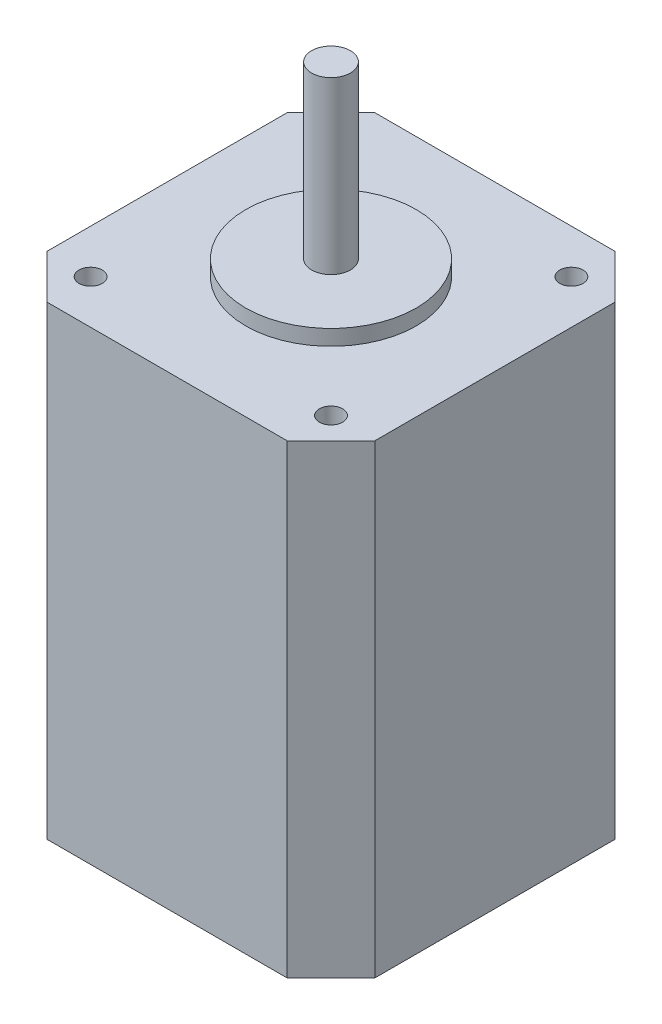
ISO-10303-21;
HEADER;
FILE_DESCRIPTION(('STEP AP214'),'2;1');
FILE_NAME('part.step','',(''),(''),'','','');
FILE_SCHEMA(('AUTOMOTIVE_DESIGN { 1 0 10303 214 1 1 1 1 }'));
ENDSEC;
DATA;
#1=APPLICATION_CONTEXT('core data for automotive mechanical design processes');
#2=APPLICATION_PROTOCOL_DEFINITION('international standard','automotive_design',2000,#1);
#3=PRODUCT_CONTEXT('',#1,'mechanical');
#4=PRODUCT('Part','Part','',(#3));
#5=PRODUCT_RELATED_PRODUCT_CATEGORY('part','',(#4));
#6=PRODUCT_DEFINITION_FORMATION('','',#4);
#7=PRODUCT_DEFINITION_CONTEXT('part definition',#1,'design');
#8=PRODUCT_DEFINITION('design','',#6,#7);
#9=PRODUCT_DEFINITION_SHAPE('','',#8);
#10=(LENGTH_UNIT() NAMED_UNIT(*) SI_UNIT(.MILLI.,.METRE.));
#11=(NAMED_UNIT(*) PLANE_ANGLE_UNIT() SI_UNIT($,.RADIAN.));
#12=(NAMED_UNIT(*) SI_UNIT($,.STERADIAN.) SOLID_ANGLE_UNIT());
#13=UNCERTAINTY_MEASURE_WITH_UNIT(LENGTH_MEASURE(1.E-05),#10,'distance_accuracy_value','');
#14=(GEOMETRIC_REPRESENTATION_CONTEXT(3) GLOBAL_UNCERTAINTY_ASSIGNED_CONTEXT((#13)) GLOBAL_UNIT_ASSIGNED_CONTEXT((#10,
#11,#12)) REPRESENTATION_CONTEXT('',''));
#15=CARTESIAN_POINT('',(0.,0.,0.));
#16=DIRECTION('',(0.,0.,1.));
#17=DIRECTION('',(1.,0.,0.));
#18=AXIS2_PLACEMENT_3D('',#15,#16,#17);
#19=CARTESIAN_POINT('',(0.,60.,0.));
#20=DIRECTION('',(0.,-1.,0.));
#21=DIRECTION('',(0.,0.,-1.));
#22=AXIS2_PLACEMENT_3D('',#19,#20,#21);
#23=PLANE('',#22);
#24=CARTESIAN_POINT('',(0.,60.,0.));
#25=DIRECTION('',(0.,-1.,0.));
#26=DIRECTION('',(0.,0.,-1.));
#27=AXIS2_PLACEMENT_3D('',#24,#25,#26);
#28=CIRCLE('',#27,11.);
#29=CARTESIAN_POINT('',(0.,60.,-11.));
#30=VERTEX_POINT('',#29);
#31=EDGE_CURVE('E38',#30,#30,#28,.F.);
#32=ORIENTED_EDGE('',*,*,#31,.F.);
#33=EDGE_LOOP('',(#32));
#34=FACE_BOUND('',#33,.T.);
#35=DIRECTION('',(0.707106781186548,0.,-0.707106781186547));
#36=VECTOR('',#35,1.);
#37=CARTESIAN_POINT('',(15.5,60.,21.15));
#38=LINE('',#37,#36);
#39=CARTESIAN_POINT('',(15.5,60.,21.15));
#40=VERTEX_POINT('',#39);
#41=CARTESIAN_POINT('',(21.15,60.,15.5));
#42=VERTEX_POINT('',#41);
#43=EDGE_CURVE('E148',#40,#42,#38,.T.);
#44=ORIENTED_EDGE('',*,*,#43,.T.);
#45=DIRECTION('',(0.,0.,-1.));
#46=VECTOR('',#45,1.);
#47=CARTESIAN_POINT('',(21.15,60.,-15.5));
#48=LINE('',#47,#46);
#49=CARTESIAN_POINT('',(21.15,60.,-15.5));
#50=VERTEX_POINT('',#49);
#51=EDGE_CURVE('E96',#42,#50,#48,.T.);
#52=ORIENTED_EDGE('',*,*,#51,.T.);
#53=DIRECTION('',(-0.707106781186547,0.,-0.707106781186548));
#54=VECTOR('',#53,1.);
#55=CARTESIAN_POINT('',(15.5,60.,-21.15));
#56=LINE('',#55,#54);
#57=CARTESIAN_POINT('',(15.5,60.,-21.15));
#58=VERTEX_POINT('',#57);
#59=EDGE_CURVE('E208',#50,#58,#56,.T.);
#60=ORIENTED_EDGE('',*,*,#59,.T.);
#61=DIRECTION('',(-1.,0.,0.));
#62=VECTOR('',#61,1.);
#63=CARTESIAN_POINT('',(-15.5,60.,-21.15));
#64=LINE('',#63,#62);
#65=CARTESIAN_POINT('',(-15.5,60.,-21.15));
#66=VERTEX_POINT('',#65);
#67=EDGE_CURVE('E214',#58,#66,#64,.T.);
#68=ORIENTED_EDGE('',*,*,#67,.T.);
#69=DIRECTION('',(-0.707106781186547,0.,0.707106781186547));
#70=VECTOR('',#69,1.);
#71=CARTESIAN_POINT('',(-21.15,60.,-15.5));
#72=LINE('',#71,#70);
#73=CARTESIAN_POINT('',(-21.15,60.,-15.5));
#74=VERTEX_POINT('',#73);
#75=EDGE_CURVE('E115',#66,#74,#72,.T.);
#76=ORIENTED_EDGE('',*,*,#75,.T.);
#77=DIRECTION('',(0.,0.,1.));
#78=VECTOR('',#77,1.);
#79=CARTESIAN_POINT('',(-21.15,60.,-15.5));
#80=LINE('',#79,#78);
#81=CARTESIAN_POINT('',(-21.15,60.,15.5));
#82=VERTEX_POINT('',#81);
#83=EDGE_CURVE('E109',#74,#82,#80,.T.);
#84=ORIENTED_EDGE('',*,*,#83,.T.);
#85=DIRECTION('',(0.707106781186548,0.,0.707106781186547));
#86=VECTOR('',#85,1.);
#87=CARTESIAN_POINT('',(-15.5,60.,21.15));
#88=LINE('',#87,#86);
#89=CARTESIAN_POINT('',(-15.5,60.,21.15));
#90=VERTEX_POINT('',#89);
#91=EDGE_CURVE('E113',#82,#90,#88,.T.);
#92=ORIENTED_EDGE('',*,*,#91,.T.);
#93=DIRECTION('',(1.,0.,0.));
#94=VECTOR('',#93,1.);
#95=CARTESIAN_POINT('',(-15.5,60.,21.15));
#96=LINE('',#95,#94);
#97=EDGE_CURVE('E52',#90,#40,#96,.T.);
#98=ORIENTED_EDGE('',*,*,#97,.T.);
#99=EDGE_LOOP('',(#44,#52,#60,#68,#76,#84,#92,#98));
#100=FACE_BOUND('',#99,.T.);
#101=CARTESIAN_POINT('',(-15.5,60.,-15.5));
#102=DIRECTION('',(0.,1.,0.));
#103=DIRECTION('',(0.,0.,1.));
#104=AXIS2_PLACEMENT_3D('',#101,#102,#103);
#105=CIRCLE('',#104,1.5);
#106=CARTESIAN_POINT('',(-15.5,60.,-17.));
#107=VERTEX_POINT('',#106);
#108=EDGE_CURVE('E137',#107,#107,#105,.T.);
#109=ORIENTED_EDGE('',*,*,#108,.F.);
#110=EDGE_LOOP('',(#109));
#111=FACE_BOUND('',#110,.T.);
#112=CARTESIAN_POINT('',(15.5,60.,-15.5));
#113=DIRECTION('',(0.,1.,0.));
#114=DIRECTION('',(0.,0.,1.));
#115=AXIS2_PLACEMENT_3D('',#112,#113,#114);
#116=CIRCLE('',#115,1.5);
#117=CARTESIAN_POINT('',(15.5,60.,-17.));
#118=VERTEX_POINT('',#117);
#119=EDGE_CURVE('E223',#118,#118,#116,.T.);
#120=ORIENTED_EDGE('',*,*,#119,.F.);
#121=EDGE_LOOP('',(#120));
#122=FACE_BOUND('',#121,.T.);
#123=CARTESIAN_POINT('',(15.5,60.,15.5));
#124=DIRECTION('',(0.,1.,0.));
#125=DIRECTION('',(0.,0.,-1.));
#126=AXIS2_PLACEMENT_3D('',#123,#124,#125);
#127=CIRCLE('',#126,1.5);
#128=CARTESIAN_POINT('',(15.5,60.,14.));
#129=VERTEX_POINT('',#128);
#130=EDGE_CURVE('E229',#129,#129,#127,.T.);
#131=ORIENTED_EDGE('',*,*,#130,.F.);
#132=EDGE_LOOP('',(#131));
#133=FACE_BOUND('',#132,.T.);
#134=CARTESIAN_POINT('',(-15.5,60.,15.5));
#135=DIRECTION('',(0.,1.,0.));
#136=DIRECTION('',(0.,0.,-1.));
#137=AXIS2_PLACEMENT_3D('',#134,#135,#136);
#138=CIRCLE('',#137,1.5);
#139=CARTESIAN_POINT('',(-15.5,60.,14.));
#140=VERTEX_POINT('',#139);
#141=EDGE_CURVE('E235',#140,#140,#138,.T.);
#142=ORIENTED_EDGE('',*,*,#141,.F.);
#143=EDGE_LOOP('',(#142));
#144=FACE_BOUND('',#143,.T.);
#145=ADVANCED_FACE('F34',(#34,#100,#111,#122,#133,#144),#23,.F.);
#146=CARTESIAN_POINT('',(0.,0.,0.));
#147=DIRECTION('',(0.,-1.,0.));
#148=DIRECTION('',(0.,0.,-1.));
#149=AXIS2_PLACEMENT_3D('',#146,#147,#148);
#150=PLANE('',#149);
#151=CARTESIAN_POINT('',(15.5,0.,15.5));
#152=DIRECTION('',(0.,1.,0.));
#153=DIRECTION('',(0.,0.,-1.));
#154=AXIS2_PLACEMENT_3D('',#151,#152,#153);
#155=CIRCLE('',#154,1.5);
#156=CARTESIAN_POINT('',(15.5,0.,14.));
#157=VERTEX_POINT('',#156);
#158=EDGE_CURVE('E232',#157,#157,#155,.T.);
#159=ORIENTED_EDGE('',*,*,#158,.T.);
#160=EDGE_LOOP('',(#159));
#161=FACE_BOUND('',#160,.T.);
#162=CARTESIAN_POINT('',(-15.5,0.,-15.5));
#163=DIRECTION('',(0.,1.,0.));
#164=DIRECTION('',(0.,0.,1.));
#165=AXIS2_PLACEMENT_3D('',#162,#163,#164);
#166=CIRCLE('',#165,1.5);
#167=CARTESIAN_POINT('',(-15.5,0.,-17.));
#168=VERTEX_POINT('',#167);
#169=EDGE_CURVE('E220',#168,#168,#166,.T.);
#170=ORIENTED_EDGE('',*,*,#169,.T.);
#171=EDGE_LOOP('',(#170));
#172=FACE_BOUND('',#171,.T.);
#173=DIRECTION('',(0.707106781186548,0.,-0.707106781186547));
#174=VECTOR('',#173,1.);
#175=CARTESIAN_POINT('',(15.5,0.,21.15));
#176=LINE('',#175,#174);
#177=CARTESIAN_POINT('',(15.5,0.,21.15));
#178=VERTEX_POINT('',#177);
#179=CARTESIAN_POINT('',(21.15,0.,15.5));
#180=VERTEX_POINT('',#179);
#181=EDGE_CURVE('E133',#178,#180,#176,.T.);
#182=ORIENTED_EDGE('',*,*,#181,.F.);
#183=DIRECTION('',(1.,0.,0.));
#184=VECTOR('',#183,1.);
#185=CARTESIAN_POINT('',(-15.5,0.,21.15));
#186=LINE('',#185,#184);
#187=CARTESIAN_POINT('',(-15.5,0.,21.15));
#188=VERTEX_POINT('',#187);
#189=EDGE_CURVE('E87',#188,#178,#186,.T.);
#190=ORIENTED_EDGE('',*,*,#189,.F.);
#191=DIRECTION('',(0.707106781186548,0.,0.707106781186547));
#192=VECTOR('',#191,1.);
#193=CARTESIAN_POINT('',(-15.5,0.,21.15));
#194=LINE('',#193,#192);
#195=CARTESIAN_POINT('',(-21.15,0.,15.5));
#196=VERTEX_POINT('',#195);
#197=EDGE_CURVE('E81',#196,#188,#194,.T.);
#198=ORIENTED_EDGE('',*,*,#197,.F.);
#199=DIRECTION('',(0.,0.,1.));
#200=VECTOR('',#199,1.);
#201=CARTESIAN_POINT('',(-21.15,0.,-15.5));
#202=LINE('',#201,#200);
#203=CARTESIAN_POINT('',(-21.15,0.,-15.5));
#204=VERTEX_POINT('',#203);
#205=EDGE_CURVE('E123',#204,#196,#202,.T.);
#206=ORIENTED_EDGE('',*,*,#205,.F.);
#207=DIRECTION('',(-0.707106781186547,0.,0.707106781186547));
#208=VECTOR('',#207,1.);
#209=CARTESIAN_POINT('',(-21.15,0.,-15.5));
#210=LINE('',#209,#208);
#211=CARTESIAN_POINT('',(-15.5,0.,-21.15));
#212=VERTEX_POINT('',#211);
#213=EDGE_CURVE('E143',#212,#204,#210,.T.);
#214=ORIENTED_EDGE('',*,*,#213,.F.);
#215=DIRECTION('',(-1.,0.,0.));
#216=VECTOR('',#215,1.);
#217=CARTESIAN_POINT('',(-15.5,0.,-21.15));
#218=LINE('',#217,#216);
#219=CARTESIAN_POINT('',(15.5,0.,-21.15));
#220=VERTEX_POINT('',#219);
#221=EDGE_CURVE('E141',#220,#212,#218,.T.);
#222=ORIENTED_EDGE('',*,*,#221,.F.);
#223=DIRECTION('',(-0.707106781186547,0.,-0.707106781186548));
#224=VECTOR('',#223,1.);
#225=CARTESIAN_POINT('',(15.5,0.,-21.15));
#226=LINE('',#225,#224);
#227=CARTESIAN_POINT('',(21.15,0.,-15.5));
#228=VERTEX_POINT('',#227);
#229=EDGE_CURVE('E139',#228,#220,#226,.T.);
#230=ORIENTED_EDGE('',*,*,#229,.F.);
#231=DIRECTION('',(0.,0.,-1.));
#232=VECTOR('',#231,1.);
#233=CARTESIAN_POINT('',(21.15,0.,-15.5));
#234=LINE('',#233,#232);
#235=EDGE_CURVE('E136',#180,#228,#234,.T.);
#236=ORIENTED_EDGE('',*,*,#235,.F.);
#237=EDGE_LOOP('',(#182,#190,#198,#206,#214,#222,#230,#236));
#238=FACE_BOUND('',#237,.T.);
#239=CARTESIAN_POINT('',(15.5,0.,-15.5));
#240=DIRECTION('',(0.,1.,0.));
#241=DIRECTION('',(0.,0.,1.));
#242=AXIS2_PLACEMENT_3D('',#239,#240,#241);
#243=CIRCLE('',#242,1.5);
#244=CARTESIAN_POINT('',(15.5,0.,-17.));
#245=VERTEX_POINT('',#244);
#246=EDGE_CURVE('E226',#245,#245,#243,.T.);
#247=ORIENTED_EDGE('',*,*,#246,.T.);
#248=EDGE_LOOP('',(#247));
#249=FACE_BOUND('',#248,.T.);
#250=CARTESIAN_POINT('',(-15.5,0.,15.5));
#251=DIRECTION('',(0.,1.,0.));
#252=DIRECTION('',(0.,0.,-1.));
#253=AXIS2_PLACEMENT_3D('',#250,#251,#252);
#254=CIRCLE('',#253,1.5);
#255=CARTESIAN_POINT('',(-15.5,0.,14.));
#256=VERTEX_POINT('',#255);
#257=EDGE_CURVE('E238',#256,#256,#254,.T.);
#258=ORIENTED_EDGE('',*,*,#257,.T.);
#259=EDGE_LOOP('',(#258));
#260=FACE_BOUND('',#259,.T.);
#261=ADVANCED_FACE('F168',(#161,#172,#238,#249,#260),#150,.T.);
#262=CARTESIAN_POINT('',(15.5,60.,21.15));
#263=DIRECTION('',(-0.707106781186547,0.,-0.707106781186548));
#264=DIRECTION('',(-0.707106781186548,0.,0.707106781186547));
#265=AXIS2_PLACEMENT_3D('',#262,#263,#264);
#266=PLANE('',#265);
#267=ORIENTED_EDGE('',*,*,#181,.T.);
#268=DIRECTION('',(0.,-1.,0.));
#269=VECTOR('',#268,1.);
#270=CARTESIAN_POINT('',(21.15,60.,15.5));
#271=LINE('',#270,#269);
#272=EDGE_CURVE('E160',#42,#180,#271,.T.);
#273=ORIENTED_EDGE('',*,*,#272,.F.);
#274=ORIENTED_EDGE('',*,*,#43,.F.);
#275=DIRECTION('',(0.,-1.,0.));
#276=VECTOR('',#275,1.);
#277=CARTESIAN_POINT('',(15.5,60.,21.15));
#278=LINE('',#277,#276);
#279=EDGE_CURVE('E129',#40,#178,#278,.T.);
#280=ORIENTED_EDGE('',*,*,#279,.T.);
#281=EDGE_LOOP('',(#267,#273,#274,#280));
#282=FACE_BOUND('',#281,.T.);
#283=ADVANCED_FACE('F36',(#282),#266,.F.);
#284=CARTESIAN_POINT('',(21.15,60.,-15.5));
#285=DIRECTION('',(-1.,0.,0.));
#286=DIRECTION('',(0.,0.,1.));
#287=AXIS2_PLACEMENT_3D('',#284,#285,#286);
#288=PLANE('',#287);
#289=ORIENTED_EDGE('',*,*,#235,.T.);
#290=DIRECTION('',(0.,-1.,0.));
#291=VECTOR('',#290,1.);
#292=CARTESIAN_POINT('',(21.15,60.,-15.5));
#293=LINE('',#292,#291);
#294=EDGE_CURVE('E158',#50,#228,#293,.T.);
#295=ORIENTED_EDGE('',*,*,#294,.F.);
#296=ORIENTED_EDGE('',*,*,#51,.F.);
#297=ORIENTED_EDGE('',*,*,#272,.T.);
#298=EDGE_LOOP('',(#289,#295,#296,#297));
#299=FACE_BOUND('',#298,.T.);
#300=ADVANCED_FACE('F196',(#299),#288,.F.);
#301=CARTESIAN_POINT('',(15.5,60.,-21.15));
#302=DIRECTION('',(-0.707106781186548,0.,0.707106781186547));
#303=DIRECTION('',(0.707106781186547,0.,0.707106781186548));
#304=AXIS2_PLACEMENT_3D('',#301,#302,#303);
#305=PLANE('',#304);
#306=ORIENTED_EDGE('',*,*,#229,.T.);
#307=DIRECTION('',(0.,-1.,0.));
#308=VECTOR('',#307,1.);
#309=CARTESIAN_POINT('',(15.5,60.,-21.15));
#310=LINE('',#309,#308);
#311=EDGE_CURVE('E155',#58,#220,#310,.T.);
#312=ORIENTED_EDGE('',*,*,#311,.F.);
#313=ORIENTED_EDGE('',*,*,#59,.F.);
#314=ORIENTED_EDGE('',*,*,#294,.T.);
#315=EDGE_LOOP('',(#306,#312,#313,#314));
#316=FACE_BOUND('',#315,.T.);
#317=ADVANCED_FACE('F193',(#316),#305,.F.);
#318=CARTESIAN_POINT('',(-15.5,60.,-21.15));
#319=DIRECTION('',(0.,0.,1.));
#320=DIRECTION('',(1.,0.,0.));
#321=AXIS2_PLACEMENT_3D('',#318,#319,#320);
#322=PLANE('',#321);
#323=ORIENTED_EDGE('',*,*,#221,.T.);
#324=DIRECTION('',(0.,-1.,0.));
#325=VECTOR('',#324,1.);
#326=CARTESIAN_POINT('',(-15.5,60.,-21.15));
#327=LINE('',#326,#325);
#328=EDGE_CURVE('E152',#66,#212,#327,.T.);
#329=ORIENTED_EDGE('',*,*,#328,.F.);
#330=ORIENTED_EDGE('',*,*,#67,.F.);
#331=ORIENTED_EDGE('',*,*,#311,.T.);
#332=EDGE_LOOP('',(#323,#329,#330,#331));
#333=FACE_BOUND('',#332,.T.);
#334=ADVANCED_FACE('F189',(#333),#322,.F.);
#335=CARTESIAN_POINT('',(-21.15,60.,-15.5));
#336=DIRECTION('',(0.707106781186547,0.,0.707106781186547));
#337=DIRECTION('',(0.707106781186548,0.,-0.707106781186548));
#338=AXIS2_PLACEMENT_3D('',#335,#336,#337);
#339=PLANE('',#338);
#340=ORIENTED_EDGE('',*,*,#213,.T.);
#341=DIRECTION('',(0.,-1.,0.));
#342=VECTOR('',#341,1.);
#343=CARTESIAN_POINT('',(-21.15,60.,-15.5));
#344=LINE('',#343,#342);
#345=EDGE_CURVE('E124',#74,#204,#344,.T.);
#346=ORIENTED_EDGE('',*,*,#345,.F.);
#347=ORIENTED_EDGE('',*,*,#75,.F.);
#348=ORIENTED_EDGE('',*,*,#328,.T.);
#349=EDGE_LOOP('',(#340,#346,#347,#348));
#350=FACE_BOUND('',#349,.T.);
#351=ADVANCED_FACE('F186',(#350),#339,.F.);
#352=CARTESIAN_POINT('',(-21.15,60.,-15.5));
#353=DIRECTION('',(1.,0.,0.));
#354=DIRECTION('',(0.,0.,-1.));
#355=AXIS2_PLACEMENT_3D('',#352,#353,#354);
#356=PLANE('',#355);
#357=ORIENTED_EDGE('',*,*,#205,.T.);
#358=DIRECTION('',(0.,-1.,0.));
#359=VECTOR('',#358,1.);
#360=CARTESIAN_POINT('',(-21.15,60.,15.5));
#361=LINE('',#360,#359);
#362=EDGE_CURVE('E120',#82,#196,#361,.T.);
#363=ORIENTED_EDGE('',*,*,#362,.F.);
#364=ORIENTED_EDGE('',*,*,#83,.F.);
#365=ORIENTED_EDGE('',*,*,#345,.T.);
#366=EDGE_LOOP('',(#357,#363,#364,#365));
#367=FACE_BOUND('',#366,.T.);
#368=ADVANCED_FACE('F121',(#367),#356,.F.);
#369=CARTESIAN_POINT('',(-15.5,60.,21.15));
#370=DIRECTION('',(0.707106781186547,0.,-0.707106781186548));
#371=DIRECTION('',(-0.707106781186548,0.,-0.707106781186547));
#372=AXIS2_PLACEMENT_3D('',#369,#370,#371);
#373=PLANE('',#372);
#374=ORIENTED_EDGE('',*,*,#197,.T.);
#375=DIRECTION('',(0.,-1.,0.));
#376=VECTOR('',#375,1.);
#377=CARTESIAN_POINT('',(-15.5,60.,21.15));
#378=LINE('',#377,#376);
#379=EDGE_CURVE('E125',#90,#188,#378,.T.);
#380=ORIENTED_EDGE('',*,*,#379,.F.);
#381=ORIENTED_EDGE('',*,*,#91,.F.);
#382=ORIENTED_EDGE('',*,*,#362,.T.);
#383=EDGE_LOOP('',(#374,#380,#381,#382));
#384=FACE_BOUND('',#383,.T.);
#385=ADVANCED_FACE('F127',(#384),#373,.F.);
#386=CARTESIAN_POINT('',(-15.5,60.,21.15));
#387=DIRECTION('',(0.,0.,-1.));
#388=DIRECTION('',(-1.,0.,0.));
#389=AXIS2_PLACEMENT_3D('',#386,#387,#388);
#390=PLANE('',#389);
#391=ORIENTED_EDGE('',*,*,#189,.T.);
#392=ORIENTED_EDGE('',*,*,#279,.F.);
#393=ORIENTED_EDGE('',*,*,#97,.F.);
#394=ORIENTED_EDGE('',*,*,#379,.T.);
#395=EDGE_LOOP('',(#391,#392,#393,#394));
#396=FACE_BOUND('',#395,.T.);
#397=ADVANCED_FACE('F179',(#396),#390,.F.);
#398=CARTESIAN_POINT('',(-15.5,60.,-15.5));
#399=DIRECTION('',(0.,-1.,0.));
#400=DIRECTION('',(0.,0.,-1.));
#401=AXIS2_PLACEMENT_3D('',#398,#399,#400);
#402=CYLINDRICAL_SURFACE('',#401,1.5);
#403=CARTESIAN_POINT('',(-15.5,60.,-17.));
#404=CARTESIAN_POINT('',(-15.5,59.375,-17.));
#405=CARTESIAN_POINT('',(-15.5,58.75,-17.));
#406=CARTESIAN_POINT('',(-15.5,57.5,-17.));
#407=CARTESIAN_POINT('',(-15.5,56.875,-17.));
#408=CARTESIAN_POINT('',(-15.5,55.625,-17.));
#409=CARTESIAN_POINT('',(-15.5,55.,-17.));
#410=CARTESIAN_POINT('',(-15.5,53.75,-17.));
#411=CARTESIAN_POINT('',(-15.5,53.125,-17.));
#412=CARTESIAN_POINT('',(-15.5,51.875,-17.));
#413=CARTESIAN_POINT('',(-15.5,51.25,-17.));
#414=CARTESIAN_POINT('',(-15.5,50.,-17.));
#415=CARTESIAN_POINT('',(-15.5,49.375,-17.));
#416=CARTESIAN_POINT('',(-15.5,48.125,-17.));
#417=CARTESIAN_POINT('',(-15.5,47.5,-17.));
#418=CARTESIAN_POINT('',(-15.5,46.25,-17.));
#419=CARTESIAN_POINT('',(-15.5,45.625,-17.));
#420=CARTESIAN_POINT('',(-15.5,44.375,-17.));
#421=CARTESIAN_POINT('',(-15.5,43.75,-17.));
#422=CARTESIAN_POINT('',(-15.5,42.5,-17.));
#423=CARTESIAN_POINT('',(-15.5,41.875,-17.));
#424=CARTESIAN_POINT('',(-15.5,40.625,-17.));
#425=CARTESIAN_POINT('',(-15.5,40.,-17.));
#426=CARTESIAN_POINT('',(-15.5,38.75,-17.));
#427=CARTESIAN_POINT('',(-15.5,38.125,-17.));
#428=CARTESIAN_POINT('',(-15.5,36.875,-17.));
#429=CARTESIAN_POINT('',(-15.5,36.25,-17.));
#430=CARTESIAN_POINT('',(-15.5,35.,-17.));
#431=CARTESIAN_POINT('',(-15.5,34.375,-17.));
#432=CARTESIAN_POINT('',(-15.5,33.125,-17.));
#433=CARTESIAN_POINT('',(-15.5,32.5,-17.));
#434=CARTESIAN_POINT('',(-15.5,31.25,-17.));
#435=CARTESIAN_POINT('',(-15.5,30.625,-17.));
#436=CARTESIAN_POINT('',(-15.5,29.375,-17.));
#437=CARTESIAN_POINT('',(-15.5,28.75,-17.));
#438=CARTESIAN_POINT('',(-15.5,27.5,-17.));
#439=CARTESIAN_POINT('',(-15.5,26.875,-17.));
#440=CARTESIAN_POINT('',(-15.5,25.625,-17.));
#441=CARTESIAN_POINT('',(-15.5,25.,-17.));
#442=CARTESIAN_POINT('',(-15.5,23.75,-17.));
#443=CARTESIAN_POINT('',(-15.5,23.125,-17.));
#444=CARTESIAN_POINT('',(-15.5,21.875,-17.));
#445=CARTESIAN_POINT('',(-15.5,21.25,-17.));
#446=CARTESIAN_POINT('',(-15.5,20.,-17.));
#447=CARTESIAN_POINT('',(-15.5,19.375,-17.));
#448=CARTESIAN_POINT('',(-15.5,18.125,-17.));
#449=CARTESIAN_POINT('',(-15.5,17.5,-17.));
#450=CARTESIAN_POINT('',(-15.5,16.25,-17.));
#451=CARTESIAN_POINT('',(-15.5,15.625,-17.));
#452=CARTESIAN_POINT('',(-15.5,14.375,-17.));
#453=CARTESIAN_POINT('',(-15.5,13.75,-17.));
#454=CARTESIAN_POINT('',(-15.5,12.5,-17.));
#455=CARTESIAN_POINT('',(-15.5,11.875,-17.));
#456=CARTESIAN_POINT('',(-15.5,10.625,-17.));
#457=CARTESIAN_POINT('',(-15.5,10.,-17.));
#458=CARTESIAN_POINT('',(-15.5,8.75,-17.));
#459=CARTESIAN_POINT('',(-15.5,8.125,-17.));
#460=CARTESIAN_POINT('',(-15.5,6.875,-17.));
#461=CARTESIAN_POINT('',(-15.5,6.25,-17.));
#462=CARTESIAN_POINT('',(-15.5,5.,-17.));
#463=CARTESIAN_POINT('',(-15.5,4.375,-17.));
#464=CARTESIAN_POINT('',(-15.5,3.125,-17.));
#465=CARTESIAN_POINT('',(-15.5,2.5,-17.));
#466=CARTESIAN_POINT('',(-15.5,1.25,-17.));
#467=CARTESIAN_POINT('',(-15.5,0.625000000000001,-17.));
#468=CARTESIAN_POINT('',(-15.5,0.,-17.));
#469=B_SPLINE_CURVE_WITH_KNOTS('',3,(#403,#404,#405,#406,#407,#408,#409,#410,#411,#412,#413,
#414,#415,#416,#417,#418,#419,#420,#421,#422,#423,#424,#425,#426,#427,#428,#429,#430,#431,#432,
#433,#434,#435,#436,#437,#438,#439,#440,#441,#442,#443,#444,#445,#446,#447,#448,#449,#450,#451,
#452,#453,#454,#455,#456,#457,#458,#459,#460,#461,#462,#463,#464,#465,#466,#467,#468),
.UNSPECIFIED.,.F.,.F.,(4,2,2,2,2,2,2,2,2,2,2,2,2,2,2,2,2,2,2,2,2,2,2,2,2,2,2,2,2,2,2,2,4),(0.,
1.87499999999999,3.75,5.625,7.49999999999999,9.37499999999999,11.25,13.125,15.,16.875,18.75,
20.625,22.5,24.375,26.25,28.125,30.,31.875,33.75,35.625,37.5,39.375,41.25,43.125,45.,46.875,
48.75,50.625,52.5,54.375,56.25,58.125,60.),.UNSPECIFIED.);
#470=EDGE_CURVE('BSEAM176',#107,#168,#469,.T.);
#471=ORIENTED_EDGE('',*,*,#108,.T.);
#472=ORIENTED_EDGE('',*,*,#169,.F.);
#473=ORIENTED_EDGE('',*,*,#470,.T.);
#474=ORIENTED_EDGE('',*,*,#470,.F.);
#475=EDGE_LOOP('',(#471,#473,#472,#474));
#476=FACE_BOUND('',#475,.T.);
#477=ADVANCED_FACE('F176',(#476),#402,.F.);
#478=CARTESIAN_POINT('',(15.5,60.,-15.5));
#479=DIRECTION('',(0.,-1.,0.));
#480=DIRECTION('',(0.,0.,-1.));
#481=AXIS2_PLACEMENT_3D('',#478,#479,#480);
#482=CYLINDRICAL_SURFACE('',#481,1.5);
#483=CARTESIAN_POINT('',(15.5,60.,-17.));
#484=CARTESIAN_POINT('',(15.5,59.375,-17.));
#485=CARTESIAN_POINT('',(15.5,58.75,-17.));
#486=CARTESIAN_POINT('',(15.5,57.5,-17.));
#487=CARTESIAN_POINT('',(15.5,56.875,-17.));
#488=CARTESIAN_POINT('',(15.5,55.625,-17.));
#489=CARTESIAN_POINT('',(15.5,55.,-17.));
#490=CARTESIAN_POINT('',(15.5,53.75,-17.));
#491=CARTESIAN_POINT('',(15.5,53.125,-17.));
#492=CARTESIAN_POINT('',(15.5,51.875,-17.));
#493=CARTESIAN_POINT('',(15.5,51.25,-17.));
#494=CARTESIAN_POINT('',(15.5,50.,-17.));
#495=CARTESIAN_POINT('',(15.5,49.375,-17.));
#496=CARTESIAN_POINT('',(15.5,48.125,-17.));
#497=CARTESIAN_POINT('',(15.5,47.5,-17.));
#498=CARTESIAN_POINT('',(15.5,46.25,-17.));
#499=CARTESIAN_POINT('',(15.5,45.625,-17.));
#500=CARTESIAN_POINT('',(15.5,44.375,-17.));
#501=CARTESIAN_POINT('',(15.5,43.75,-17.));
#502=CARTESIAN_POINT('',(15.5,42.5,-17.));
#503=CARTESIAN_POINT('',(15.5,41.875,-17.));
#504=CARTESIAN_POINT('',(15.5,40.625,-17.));
#505=CARTESIAN_POINT('',(15.5,40.,-17.));
#506=CARTESIAN_POINT('',(15.5,38.75,-17.));
#507=CARTESIAN_POINT('',(15.5,38.125,-17.));
#508=CARTESIAN_POINT('',(15.5,36.875,-17.));
#509=CARTESIAN_POINT('',(15.5,36.25,-17.));
#510=CARTESIAN_POINT('',(15.5,35.,-17.));
#511=CARTESIAN_POINT('',(15.5,34.375,-17.));
#512=CARTESIAN_POINT('',(15.5,33.125,-17.));
#513=CARTESIAN_POINT('',(15.5,32.5,-17.));
#514=CARTESIAN_POINT('',(15.5,31.25,-17.));
#515=CARTESIAN_POINT('',(15.5,30.625,-17.));
#516=CARTESIAN_POINT('',(15.5,29.375,-17.));
#517=CARTESIAN_POINT('',(15.5,28.75,-17.));
#518=CARTESIAN_POINT('',(15.5,27.5,-17.));
#519=CARTESIAN_POINT('',(15.5,26.875,-17.));
#520=CARTESIAN_POINT('',(15.5,25.625,-17.));
#521=CARTESIAN_POINT('',(15.5,25.,-17.));
#522=CARTESIAN_POINT('',(15.5,23.75,-17.));
#523=CARTESIAN_POINT('',(15.5,23.125,-17.));
#524=CARTESIAN_POINT('',(15.5,21.875,-17.));
#525=CARTESIAN_POINT('',(15.5,21.25,-17.));
#526=CARTESIAN_POINT('',(15.5,20.,-17.));
#527=CARTESIAN_POINT('',(15.5,19.375,-17.));
#528=CARTESIAN_POINT('',(15.5,18.125,-17.));
#529=CARTESIAN_POINT('',(15.5,17.5,-17.));
#530=CARTESIAN_POINT('',(15.5,16.25,-17.));
#531=CARTESIAN_POINT('',(15.5,15.625,-17.));
#532=CARTESIAN_POINT('',(15.5,14.375,-17.));
#533=CARTESIAN_POINT('',(15.5,13.75,-17.));
#534=CARTESIAN_POINT('',(15.5,12.5,-17.));
#535=CARTESIAN_POINT('',(15.5,11.875,-17.));
#536=CARTESIAN_POINT('',(15.5,10.625,-17.));
#537=CARTESIAN_POINT('',(15.5,10.,-17.));
#538=CARTESIAN_POINT('',(15.5,8.75,-17.));
#539=CARTESIAN_POINT('',(15.5,8.125,-17.));
#540=CARTESIAN_POINT('',(15.5,6.875,-17.));
#541=CARTESIAN_POINT('',(15.5,6.25,-17.));
#542=CARTESIAN_POINT('',(15.5,5.,-17.));
#543=CARTESIAN_POINT('',(15.5,4.375,-17.));
#544=CARTESIAN_POINT('',(15.5,3.125,-17.));
#545=CARTESIAN_POINT('',(15.5,2.5,-17.));
#546=CARTESIAN_POINT('',(15.5,1.25,-17.));
#547=CARTESIAN_POINT('',(15.5,0.625000000000001,-17.));
#548=CARTESIAN_POINT('',(15.5,0.,-17.));
#549=B_SPLINE_CURVE_WITH_KNOTS('',3,(#483,#484,#485,#486,#487,#488,#489,#490,#491,#492,#493,
#494,#495,#496,#497,#498,#499,#500,#501,#502,#503,#504,#505,#506,#507,#508,#509,#510,#511,#512,
#513,#514,#515,#516,#517,#518,#519,#520,#521,#522,#523,#524,#525,#526,#527,#528,#529,#530,#531,
#532,#533,#534,#535,#536,#537,#538,#539,#540,#541,#542,#543,#544,#545,#546,#547,#548),
.UNSPECIFIED.,.F.,.F.,(4,2,2,2,2,2,2,2,2,2,2,2,2,2,2,2,2,2,2,2,2,2,2,2,2,2,2,2,2,2,2,2,4),(0.,
1.87499999999999,3.75,5.625,7.49999999999999,9.37499999999999,11.25,13.125,15.,16.875,18.75,
20.625,22.5,24.375,26.25,28.125,30.,31.875,33.75,35.625,37.5,39.375,41.25,43.125,45.,46.875,
48.75,50.625,52.5,54.375,56.25,58.125,60.),.UNSPECIFIED.);
#550=EDGE_CURVE('BSEAM275',#118,#245,#549,.T.);
#551=ORIENTED_EDGE('',*,*,#119,.T.);
#552=ORIENTED_EDGE('',*,*,#246,.F.);
#553=ORIENTED_EDGE('',*,*,#550,.T.);
#554=ORIENTED_EDGE('',*,*,#550,.F.);
#555=EDGE_LOOP('',(#551,#553,#552,#554));
#556=FACE_BOUND('',#555,.T.);
#557=ADVANCED_FACE('F275',(#556),#482,.F.);
#558=CARTESIAN_POINT('',(15.5,60.,15.5));
#559=DIRECTION('',(0.,-1.,0.));
#560=DIRECTION('',(0.,0.,-1.));
#561=AXIS2_PLACEMENT_3D('',#558,#559,#560);
#562=CYLINDRICAL_SURFACE('',#561,1.5);
#563=CARTESIAN_POINT('',(15.5,60.,14.));
#564=CARTESIAN_POINT('',(15.5,59.375,14.));
#565=CARTESIAN_POINT('',(15.5,58.75,14.));
#566=CARTESIAN_POINT('',(15.5,57.5,14.));
#567=CARTESIAN_POINT('',(15.5,56.875,14.));
#568=CARTESIAN_POINT('',(15.5,55.625,14.));
#569=CARTESIAN_POINT('',(15.5,55.,14.));
#570=CARTESIAN_POINT('',(15.5,53.75,14.));
#571=CARTESIAN_POINT('',(15.5,53.125,14.));
#572=CARTESIAN_POINT('',(15.5,51.875,14.));
#573=CARTESIAN_POINT('',(15.5,51.25,14.));
#574=CARTESIAN_POINT('',(15.5,50.,14.));
#575=CARTESIAN_POINT('',(15.5,49.375,14.));
#576=CARTESIAN_POINT('',(15.5,48.125,14.));
#577=CARTESIAN_POINT('',(15.5,47.5,14.));
#578=CARTESIAN_POINT('',(15.5,46.25,14.));
#579=CARTESIAN_POINT('',(15.5,45.625,14.));
#580=CARTESIAN_POINT('',(15.5,44.375,14.));
#581=CARTESIAN_POINT('',(15.5,43.75,14.));
#582=CARTESIAN_POINT('',(15.5,42.5,14.));
#583=CARTESIAN_POINT('',(15.5,41.875,14.));
#584=CARTESIAN_POINT('',(15.5,40.625,14.));
#585=CARTESIAN_POINT('',(15.5,40.,14.));
#586=CARTESIAN_POINT('',(15.5,38.75,14.));
#587=CARTESIAN_POINT('',(15.5,38.125,14.));
#588=CARTESIAN_POINT('',(15.5,36.875,14.));
#589=CARTESIAN_POINT('',(15.5,36.25,14.));
#590=CARTESIAN_POINT('',(15.5,35.,14.));
#591=CARTESIAN_POINT('',(15.5,34.375,14.));
#592=CARTESIAN_POINT('',(15.5,33.125,14.));
#593=CARTESIAN_POINT('',(15.5,32.5,14.));
#594=CARTESIAN_POINT('',(15.5,31.25,14.));
#595=CARTESIAN_POINT('',(15.5,30.625,14.));
#596=CARTESIAN_POINT('',(15.5,29.375,14.));
#597=CARTESIAN_POINT('',(15.5,28.75,14.));
#598=CARTESIAN_POINT('',(15.5,27.5,14.));
#599=CARTESIAN_POINT('',(15.5,26.875,14.));
#600=CARTESIAN_POINT('',(15.5,25.625,14.));
#601=CARTESIAN_POINT('',(15.5,25.,14.));
#602=CARTESIAN_POINT('',(15.5,23.75,14.));
#603=CARTESIAN_POINT('',(15.5,23.125,14.));
#604=CARTESIAN_POINT('',(15.5,21.875,14.));
#605=CARTESIAN_POINT('',(15.5,21.25,14.));
#606=CARTESIAN_POINT('',(15.5,20.,14.));
#607=CARTESIAN_POINT('',(15.5,19.375,14.));
#608=CARTESIAN_POINT('',(15.5,18.125,14.));
#609=CARTESIAN_POINT('',(15.5,17.5,14.));
#610=CARTESIAN_POINT('',(15.5,16.25,14.));
#611=CARTESIAN_POINT('',(15.5,15.625,14.));
#612=CARTESIAN_POINT('',(15.5,14.375,14.));
#613=CARTESIAN_POINT('',(15.5,13.75,14.));
#614=CARTESIAN_POINT('',(15.5,12.5,14.));
#615=CARTESIAN_POINT('',(15.5,11.875,14.));
#616=CARTESIAN_POINT('',(15.5,10.625,14.));
#617=CARTESIAN_POINT('',(15.5,10.,14.));
#618=CARTESIAN_POINT('',(15.5,8.75,14.));
#619=CARTESIAN_POINT('',(15.5,8.125,14.));
#620=CARTESIAN_POINT('',(15.5,6.875,14.));
#621=CARTESIAN_POINT('',(15.5,6.25,14.));
#622=CARTESIAN_POINT('',(15.5,5.,14.));
#623=CARTESIAN_POINT('',(15.5,4.375,14.));
#624=CARTESIAN_POINT('',(15.5,3.125,14.));
#625=CARTESIAN_POINT('',(15.5,2.5,14.));
#626=CARTESIAN_POINT('',(15.5,1.25,14.));
#627=CARTESIAN_POINT('',(15.5,0.625000000000001,14.));
#628=CARTESIAN_POINT('',(15.5,0.,14.));
#629=B_SPLINE_CURVE_WITH_KNOTS('',3,(#563,#564,#565,#566,#567,#568,#569,#570,#571,#572,#573,
#574,#575,#576,#577,#578,#579,#580,#581,#582,#583,#584,#585,#586,#587,#588,#589,#590,#591,#592,
#593,#594,#595,#596,#597,#598,#599,#600,#601,#602,#603,#604,#605,#606,#607,#608,#609,#610,#611,
#612,#613,#614,#615,#616,#617,#618,#619,#620,#621,#622,#623,#624,#625,#626,#627,#628),
.UNSPECIFIED.,.F.,.F.,(4,2,2,2,2,2,2,2,2,2,2,2,2,2,2,2,2,2,2,2,2,2,2,2,2,2,2,2,2,2,2,2,4),(0.,
1.87499999999999,3.75,5.625,7.49999999999999,9.37499999999999,11.25,13.125,15.,16.875,18.75,
20.625,22.5,24.375,26.25,28.125,30.,31.875,33.75,35.625,37.5,39.375,41.25,43.125,45.,46.875,
48.75,50.625,52.5,54.375,56.25,58.125,60.),.UNSPECIFIED.);
#630=EDGE_CURVE('BSEAM270',#129,#157,#629,.T.);
#631=ORIENTED_EDGE('',*,*,#130,.T.);
#632=ORIENTED_EDGE('',*,*,#158,.F.);
#633=ORIENTED_EDGE('',*,*,#630,.T.);
#634=ORIENTED_EDGE('',*,*,#630,.F.);
#635=EDGE_LOOP('',(#631,#633,#632,#634));
#636=FACE_BOUND('',#635,.T.);
#637=ADVANCED_FACE('F270',(#636),#562,.F.);
#638=CARTESIAN_POINT('',(-15.5,60.,15.5));
#639=DIRECTION('',(0.,-1.,0.));
#640=DIRECTION('',(0.,0.,-1.));
#641=AXIS2_PLACEMENT_3D('',#638,#639,#640);
#642=CYLINDRICAL_SURFACE('',#641,1.5);
#643=CARTESIAN_POINT('',(-15.5,60.,14.));
#644=CARTESIAN_POINT('',(-15.5,59.375,14.));
#645=CARTESIAN_POINT('',(-15.5,58.75,14.));
#646=CARTESIAN_POINT('',(-15.5,57.5,14.));
#647=CARTESIAN_POINT('',(-15.5,56.875,14.));
#648=CARTESIAN_POINT('',(-15.5,55.625,14.));
#649=CARTESIAN_POINT('',(-15.5,55.,14.));
#650=CARTESIAN_POINT('',(-15.5,53.75,14.));
#651=CARTESIAN_POINT('',(-15.5,53.125,14.));
#652=CARTESIAN_POINT('',(-15.5,51.875,14.));
#653=CARTESIAN_POINT('',(-15.5,51.25,14.));
#654=CARTESIAN_POINT('',(-15.5,50.,14.));
#655=CARTESIAN_POINT('',(-15.5,49.375,14.));
#656=CARTESIAN_POINT('',(-15.5,48.125,14.));
#657=CARTESIAN_POINT('',(-15.5,47.5,14.));
#658=CARTESIAN_POINT('',(-15.5,46.25,14.));
#659=CARTESIAN_POINT('',(-15.5,45.625,14.));
#660=CARTESIAN_POINT('',(-15.5,44.375,14.));
#661=CARTESIAN_POINT('',(-15.5,43.75,14.));
#662=CARTESIAN_POINT('',(-15.5,42.5,14.));
#663=CARTESIAN_POINT('',(-15.5,41.875,14.));
#664=CARTESIAN_POINT('',(-15.5,40.625,14.));
#665=CARTESIAN_POINT('',(-15.5,40.,14.));
#666=CARTESIAN_POINT('',(-15.5,38.75,14.));
#667=CARTESIAN_POINT('',(-15.5,38.125,14.));
#668=CARTESIAN_POINT('',(-15.5,36.875,14.));
#669=CARTESIAN_POINT('',(-15.5,36.25,14.));
#670=CARTESIAN_POINT('',(-15.5,35.,14.));
#671=CARTESIAN_POINT('',(-15.5,34.375,14.));
#672=CARTESIAN_POINT('',(-15.5,33.125,14.));
#673=CARTESIAN_POINT('',(-15.5,32.5,14.));
#674=CARTESIAN_POINT('',(-15.5,31.25,14.));
#675=CARTESIAN_POINT('',(-15.5,30.625,14.));
#676=CARTESIAN_POINT('',(-15.5,29.375,14.));
#677=CARTESIAN_POINT('',(-15.5,28.75,14.));
#678=CARTESIAN_POINT('',(-15.5,27.5,14.));
#679=CARTESIAN_POINT('',(-15.5,26.875,14.));
#680=CARTESIAN_POINT('',(-15.5,25.625,14.));
#681=CARTESIAN_POINT('',(-15.5,25.,14.));
#682=CARTESIAN_POINT('',(-15.5,23.75,14.));
#683=CARTESIAN_POINT('',(-15.5,23.125,14.));
#684=CARTESIAN_POINT('',(-15.5,21.875,14.));
#685=CARTESIAN_POINT('',(-15.5,21.25,14.));
#686=CARTESIAN_POINT('',(-15.5,20.,14.));
#687=CARTESIAN_POINT('',(-15.5,19.375,14.));
#688=CARTESIAN_POINT('',(-15.5,18.125,14.));
#689=CARTESIAN_POINT('',(-15.5,17.5,14.));
#690=CARTESIAN_POINT('',(-15.5,16.25,14.));
#691=CARTESIAN_POINT('',(-15.5,15.625,14.));
#692=CARTESIAN_POINT('',(-15.5,14.375,14.));
#693=CARTESIAN_POINT('',(-15.5,13.75,14.));
#694=CARTESIAN_POINT('',(-15.5,12.5,14.));
#695=CARTESIAN_POINT('',(-15.5,11.875,14.));
#696=CARTESIAN_POINT('',(-15.5,10.625,14.));
#697=CARTESIAN_POINT('',(-15.5,10.,14.));
#698=CARTESIAN_POINT('',(-15.5,8.75,14.));
#699=CARTESIAN_POINT('',(-15.5,8.125,14.));
#700=CARTESIAN_POINT('',(-15.5,6.875,14.));
#701=CARTESIAN_POINT('',(-15.5,6.25,14.));
#702=CARTESIAN_POINT('',(-15.5,5.,14.));
#703=CARTESIAN_POINT('',(-15.5,4.375,14.));
#704=CARTESIAN_POINT('',(-15.5,3.125,14.));
#705=CARTESIAN_POINT('',(-15.5,2.5,14.));
#706=CARTESIAN_POINT('',(-15.5,1.25,14.));
#707=CARTESIAN_POINT('',(-15.5,0.625000000000001,14.));
#708=CARTESIAN_POINT('',(-15.5,0.,14.));
#709=B_SPLINE_CURVE_WITH_KNOTS('',3,(#643,#644,#645,#646,#647,#648,#649,#650,#651,#652,#653,
#654,#655,#656,#657,#658,#659,#660,#661,#662,#663,#664,#665,#666,#667,#668,#669,#670,#671,#672,
#673,#674,#675,#676,#677,#678,#679,#680,#681,#682,#683,#684,#685,#686,#687,#688,#689,#690,#691,
#692,#693,#694,#695,#696,#697,#698,#699,#700,#701,#702,#703,#704,#705,#706,#707,#708),
.UNSPECIFIED.,.F.,.F.,(4,2,2,2,2,2,2,2,2,2,2,2,2,2,2,2,2,2,2,2,2,2,2,2,2,2,2,2,2,2,2,2,4),(0.,
1.87499999999999,3.75,5.625,7.49999999999999,9.37499999999999,11.25,13.125,15.,16.875,18.75,
20.625,22.5,24.375,26.25,28.125,30.,31.875,33.75,35.625,37.5,39.375,41.25,43.125,45.,46.875,
48.75,50.625,52.5,54.375,56.25,58.125,60.),.UNSPECIFIED.);
#710=EDGE_CURVE('BSEAM265',#140,#256,#709,.T.);
#711=ORIENTED_EDGE('',*,*,#141,.T.);
#712=ORIENTED_EDGE('',*,*,#257,.F.);
#713=ORIENTED_EDGE('',*,*,#710,.T.);
#714=ORIENTED_EDGE('',*,*,#710,.F.);
#715=EDGE_LOOP('',(#711,#713,#712,#714));
#716=FACE_BOUND('',#715,.T.);
#717=ADVANCED_FACE('F265',(#716),#642,.F.);
#718=CARTESIAN_POINT('',(0.,62.,0.));
#719=DIRECTION('',(0.,-1.,0.));
#720=DIRECTION('',(0.,0.,-1.));
#721=AXIS2_PLACEMENT_3D('',#718,#719,#720);
#722=CYLINDRICAL_SURFACE('',#721,11.);
#723=CARTESIAN_POINT('',(0.,62.,0.));
#724=DIRECTION('',(0.,1.,0.));
#725=DIRECTION('',(0.,0.,1.));
#726=AXIS2_PLACEMENT_3D('',#723,#724,#725);
#727=CIRCLE('',#726,11.);
#728=CARTESIAN_POINT('',(0.,62.,11.));
#729=VERTEX_POINT('',#728);
#730=EDGE_CURVE('E241',#729,#729,#727,.T.);
#731=ORIENTED_EDGE('',*,*,#730,.F.);
#732=EDGE_LOOP('',(#731));
#733=FACE_BOUND('',#732,.T.);
#734=ORIENTED_EDGE('',*,*,#31,.T.);
#735=EDGE_LOOP('',(#734));
#736=FACE_BOUND('',#735,.T.);
#737=ADVANCED_FACE('F165',(#733,#736),#722,.T.);
#738=CARTESIAN_POINT('',(0.,62.,0.));
#739=DIRECTION('',(0.,1.,0.));
#740=DIRECTION('',(0.,0.,1.));
#741=AXIS2_PLACEMENT_3D('',#738,#739,#740);
#742=PLANE('',#741);
#743=CARTESIAN_POINT('',(0.,62.,0.));
#744=DIRECTION('',(0.,1.,0.));
#745=DIRECTION('',(0.,0.,1.));
#746=AXIS2_PLACEMENT_3D('',#743,#744,#745);
#747=CIRCLE('',#746,2.5);
#748=CARTESIAN_POINT('',(0.,62.,2.5));
#749=VERTEX_POINT('',#748);
#750=EDGE_CURVE('E11',#749,#749,#747,.T.);
#751=ORIENTED_EDGE('',*,*,#750,.F.);
#752=EDGE_LOOP('',(#751));
#753=FACE_BOUND('',#752,.T.);
#754=ORIENTED_EDGE('',*,*,#730,.T.);
#755=EDGE_LOOP('',(#754));
#756=FACE_BOUND('',#755,.T.);
#757=ADVANCED_FACE('F255',(#753,#756),#742,.T.);
#758=CARTESIAN_POINT('',(0.,84.,0.));
#759=DIRECTION('',(0.,-1.,0.));
#760=DIRECTION('',(0.,0.,-1.));
#761=AXIS2_PLACEMENT_3D('',#758,#759,#760);
#762=CYLINDRICAL_SURFACE('',#761,2.5);
#763=CARTESIAN_POINT('',(0.,84.,0.));
#764=DIRECTION('',(0.,1.,0.));
#765=DIRECTION('',(0.,0.,1.));
#766=AXIS2_PLACEMENT_3D('',#763,#764,#765);
#767=CIRCLE('',#766,2.5);
#768=CARTESIAN_POINT('',(0.,84.,2.5));
#769=VERTEX_POINT('',#768);
#770=EDGE_CURVE('E245',#769,#769,#767,.T.);
#771=ORIENTED_EDGE('',*,*,#770,.F.);
#772=EDGE_LOOP('',(#771));
#773=FACE_BOUND('',#772,.T.);
#774=ORIENTED_EDGE('',*,*,#750,.T.);
#775=EDGE_LOOP('',(#774));
#776=FACE_BOUND('',#775,.T.);
#777=ADVANCED_FACE('F252',(#773,#776),#762,.T.);
#778=CARTESIAN_POINT('',(0.,84.,0.));
#779=DIRECTION('',(0.,1.,0.));
#780=DIRECTION('',(0.,0.,1.));
#781=AXIS2_PLACEMENT_3D('',#778,#779,#780);
#782=PLANE('',#781);
#783=ORIENTED_EDGE('',*,*,#770,.T.);
#784=EDGE_LOOP('',(#783));
#785=FACE_BOUND('',#784,.T.);
#786=ADVANCED_FACE('F250',(#785),#782,.T.);
#787=CLOSED_SHELL('',(#145,#261,#283,#300,#317,#334,#351,#368,#385,#397,#477,#557,#637,#717,
#737,#757,#777,#786));
#788=MANIFOLD_SOLID_BREP('B2',#787);
#789=ADVANCED_BREP_SHAPE_REPRESENTATION('',(#18,#788),#14);
#790=SHAPE_DEFINITION_REPRESENTATION(#9,#789);
ENDSEC;
END-ISO-10303-21;
